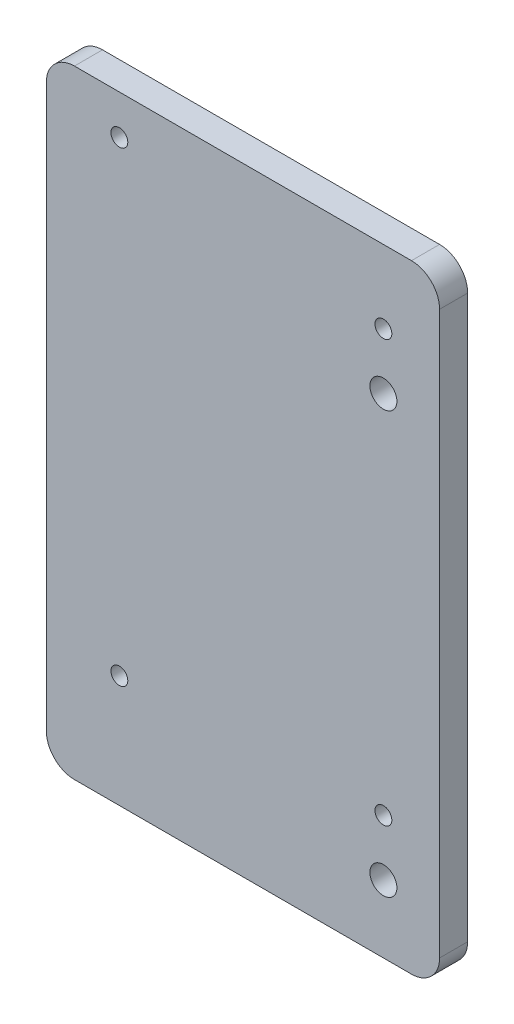
ISO-10303-21;
HEADER;
FILE_DESCRIPTION(('STEP AP214'),'2;1');
FILE_NAME('part.step','',(''),(''),'','','');
FILE_SCHEMA(('AUTOMOTIVE_DESIGN { 1 0 10303 214 1 1 1 1 }'));
ENDSEC;
DATA;
#1=APPLICATION_CONTEXT('core data for automotive mechanical design processes');
#2=APPLICATION_PROTOCOL_DEFINITION('international standard','automotive_design',2000,#1);
#3=PRODUCT_CONTEXT('',#1,'mechanical');
#4=PRODUCT('Part','Part','',(#3));
#5=PRODUCT_RELATED_PRODUCT_CATEGORY('part','',(#4));
#6=PRODUCT_DEFINITION_FORMATION('','',#4);
#7=PRODUCT_DEFINITION_CONTEXT('part definition',#1,'design');
#8=PRODUCT_DEFINITION('design','',#6,#7);
#9=PRODUCT_DEFINITION_SHAPE('','',#8);
#10=(LENGTH_UNIT() NAMED_UNIT(*) SI_UNIT(.MILLI.,.METRE.));
#11=(NAMED_UNIT(*) PLANE_ANGLE_UNIT() SI_UNIT($,.RADIAN.));
#12=(NAMED_UNIT(*) SI_UNIT($,.STERADIAN.) SOLID_ANGLE_UNIT());
#13=UNCERTAINTY_MEASURE_WITH_UNIT(LENGTH_MEASURE(1.E-05),#10,'distance_accuracy_value','');
#14=(GEOMETRIC_REPRESENTATION_CONTEXT(3) GLOBAL_UNCERTAINTY_ASSIGNED_CONTEXT((#13)) GLOBAL_UNIT_ASSIGNED_CONTEXT((#10,
#11,#12)) REPRESENTATION_CONTEXT('',''));
#15=CARTESIAN_POINT('',(0.,0.,0.));
#16=DIRECTION('',(0.,0.,1.));
#17=DIRECTION('',(1.,0.,0.));
#18=AXIS2_PLACEMENT_3D('',#15,#16,#17);
#19=CARTESIAN_POINT('',(0.,0.,5.));
#20=DIRECTION('',(0.,0.,1.));
#21=DIRECTION('',(1.,0.,0.));
#22=AXIS2_PLACEMENT_3D('',#19,#20,#21);
#23=PLANE('',#22);
#24=CARTESIAN_POINT('',(-22.,48.,5.));
#25=DIRECTION('',(0.,0.,1.));
#26=DIRECTION('',(1.,0.,0.));
#27=AXIS2_PLACEMENT_3D('',#24,#25,#26);
#28=CIRCLE('',#27,1.5);
#29=CARTESIAN_POINT('',(-20.5,48.,5.));
#30=VERTEX_POINT('',#29);
#31=EDGE_CURVE('E198',#30,#30,#28,.T.);
#32=ORIENTED_EDGE('',*,*,#31,.F.);
#33=EDGE_LOOP('',(#32));
#34=FACE_BOUND('',#33,.T.);
#35=CARTESIAN_POINT('',(25.,32.,5.));
#36=DIRECTION('',(0.,0.,1.));
#37=DIRECTION('',(1.,0.,0.));
#38=AXIS2_PLACEMENT_3D('',#35,#36,#37);
#39=CIRCLE('',#38,2.4);
#40=CARTESIAN_POINT('',(27.4,32.,5.));
#41=VERTEX_POINT('',#40);
#42=EDGE_CURVE('E186',#41,#41,#39,.T.);
#43=ORIENTED_EDGE('',*,*,#42,.F.);
#44=EDGE_LOOP('',(#43));
#45=FACE_BOUND('',#44,.T.);
#46=CARTESIAN_POINT('',(25.,42.,5.));
#47=DIRECTION('',(0.,0.,1.));
#48=DIRECTION('',(1.,0.,0.));
#49=AXIS2_PLACEMENT_3D('',#46,#47,#48);
#50=CIRCLE('',#49,1.5);
#51=CARTESIAN_POINT('',(26.5,42.,5.));
#52=VERTEX_POINT('',#51);
#53=EDGE_CURVE('E127',#52,#52,#50,.T.);
#54=ORIENTED_EDGE('',*,*,#53,.F.);
#55=EDGE_LOOP('',(#54));
#56=FACE_BOUND('',#55,.T.);
#57=DIRECTION('',(1.,0.,0.));
#58=VECTOR('',#57,1.);
#59=CARTESIAN_POINT('',(-35.,-55.,5.));
#60=LINE('',#59,#58);
#61=CARTESIAN_POINT('',(-30.,-55.,5.));
#62=VERTEX_POINT('',#61);
#63=CARTESIAN_POINT('',(30.,-55.,5.));
#64=VERTEX_POINT('',#63);
#65=EDGE_CURVE('E136',#62,#64,#60,.T.);
#66=ORIENTED_EDGE('',*,*,#65,.T.);
#67=CARTESIAN_POINT('',(30.,-50.,5.));
#68=DIRECTION('',(0.,0.,1.));
#69=DIRECTION('',(1.,0.,0.));
#70=AXIS2_PLACEMENT_3D('',#67,#68,#69);
#71=CIRCLE('',#70,5.);
#72=CARTESIAN_POINT('',(35.,-50.,5.));
#73=VERTEX_POINT('',#72);
#74=EDGE_CURVE('E155',#64,#73,#71,.T.);
#75=ORIENTED_EDGE('',*,*,#74,.T.);
#76=DIRECTION('',(0.,1.,0.));
#77=VECTOR('',#76,1.);
#78=CARTESIAN_POINT('',(35.,55.,5.));
#79=LINE('',#78,#77);
#80=CARTESIAN_POINT('',(35.,50.,5.));
#81=VERTEX_POINT('',#80);
#82=EDGE_CURVE('E119',#73,#81,#79,.T.);
#83=ORIENTED_EDGE('',*,*,#82,.T.);
#84=CARTESIAN_POINT('',(30.,50.,5.));
#85=DIRECTION('',(0.,0.,1.));
#86=DIRECTION('',(1.,0.,0.));
#87=AXIS2_PLACEMENT_3D('',#84,#85,#86);
#88=CIRCLE('',#87,5.);
#89=CARTESIAN_POINT('',(30.,55.,5.));
#90=VERTEX_POINT('',#89);
#91=EDGE_CURVE('E150',#81,#90,#88,.T.);
#92=ORIENTED_EDGE('',*,*,#91,.T.);
#93=DIRECTION('',(-1.,0.,0.));
#94=VECTOR('',#93,1.);
#95=CARTESIAN_POINT('',(-35.,55.,5.));
#96=LINE('',#95,#94);
#97=CARTESIAN_POINT('',(-30.,55.,5.));
#98=VERTEX_POINT('',#97);
#99=EDGE_CURVE('E166',#90,#98,#96,.T.);
#100=ORIENTED_EDGE('',*,*,#99,.T.);
#101=CARTESIAN_POINT('',(-30.,50.,5.));
#102=DIRECTION('',(0.,0.,1.));
#103=DIRECTION('',(1.,0.,0.));
#104=AXIS2_PLACEMENT_3D('',#101,#102,#103);
#105=CIRCLE('',#104,5.);
#106=CARTESIAN_POINT('',(-35.,50.,5.));
#107=VERTEX_POINT('',#106);
#108=EDGE_CURVE('E55',#98,#107,#105,.T.);
#109=ORIENTED_EDGE('',*,*,#108,.T.);
#110=DIRECTION('',(0.,-1.,0.));
#111=VECTOR('',#110,1.);
#112=CARTESIAN_POINT('',(-35.,55.,5.));
#113=LINE('',#112,#111);
#114=CARTESIAN_POINT('',(-35.,-50.,5.));
#115=VERTEX_POINT('',#114);
#116=EDGE_CURVE('E174',#107,#115,#113,.T.);
#117=ORIENTED_EDGE('',*,*,#116,.T.);
#118=CARTESIAN_POINT('',(-30.,-50.,5.));
#119=DIRECTION('',(0.,0.,1.));
#120=DIRECTION('',(1.,0.,0.));
#121=AXIS2_PLACEMENT_3D('',#118,#119,#120);
#122=CIRCLE('',#121,5.);
#123=EDGE_CURVE('E153',#115,#62,#122,.T.);
#124=ORIENTED_EDGE('',*,*,#123,.T.);
#125=EDGE_LOOP('',(#66,#75,#83,#92,#100,#109,#117,#124));
#126=FACE_BOUND('',#125,.T.);
#127=CARTESIAN_POINT('',(25.,-33.,5.));
#128=DIRECTION('',(0.,0.,1.));
#129=DIRECTION('',(1.,0.,0.));
#130=AXIS2_PLACEMENT_3D('',#127,#128,#129);
#131=CIRCLE('',#130,1.5);
#132=CARTESIAN_POINT('',(26.5,-33.,5.));
#133=VERTEX_POINT('',#132);
#134=EDGE_CURVE('E181',#133,#133,#131,.T.);
#135=ORIENTED_EDGE('',*,*,#134,.F.);
#136=EDGE_LOOP('',(#135));
#137=FACE_BOUND('',#136,.T.);
#138=CARTESIAN_POINT('',(25.,-43.,5.));
#139=DIRECTION('',(0.,0.,1.));
#140=DIRECTION('',(1.,0.,0.));
#141=AXIS2_PLACEMENT_3D('',#138,#139,#140);
#142=CIRCLE('',#141,2.4);
#143=CARTESIAN_POINT('',(27.4,-43.,5.));
#144=VERTEX_POINT('',#143);
#145=EDGE_CURVE('E192',#144,#144,#142,.T.);
#146=ORIENTED_EDGE('',*,*,#145,.F.);
#147=EDGE_LOOP('',(#146));
#148=FACE_BOUND('',#147,.T.);
#149=CARTESIAN_POINT('',(-22.,-35.,5.));
#150=DIRECTION('',(0.,0.,1.));
#151=DIRECTION('',(1.,0.,0.));
#152=AXIS2_PLACEMENT_3D('',#149,#150,#151);
#153=CIRCLE('',#152,1.5);
#154=CARTESIAN_POINT('',(-20.5,-35.,5.));
#155=VERTEX_POINT('',#154);
#156=EDGE_CURVE('E204',#155,#155,#153,.T.);
#157=ORIENTED_EDGE('',*,*,#156,.F.);
#158=EDGE_LOOP('',(#157));
#159=FACE_BOUND('',#158,.T.);
#160=ADVANCED_FACE('F33',(#34,#45,#56,#126,#137,#148,#159),#23,.T.);
#161=CARTESIAN_POINT('',(0.,0.,0.));
#162=DIRECTION('',(0.,0.,1.));
#163=DIRECTION('',(1.,0.,0.));
#164=AXIS2_PLACEMENT_3D('',#161,#162,#163);
#165=PLANE('',#164);
#166=DIRECTION('',(0.,1.,0.));
#167=VECTOR('',#166,1.);
#168=CARTESIAN_POINT('',(35.,55.,0.));
#169=LINE('',#168,#167);
#170=CARTESIAN_POINT('',(35.,-50.,0.));
#171=VERTEX_POINT('',#170);
#172=CARTESIAN_POINT('',(35.,50.,0.));
#173=VERTEX_POINT('',#172);
#174=EDGE_CURVE('E116',#171,#173,#169,.T.);
#175=ORIENTED_EDGE('',*,*,#174,.F.);
#176=CARTESIAN_POINT('',(30.,-50.,0.));
#177=DIRECTION('',(0.,0.,1.));
#178=DIRECTION('',(1.,0.,0.));
#179=AXIS2_PLACEMENT_3D('',#176,#177,#178);
#180=CIRCLE('',#179,5.);
#181=CARTESIAN_POINT('',(30.,-55.,0.));
#182=VERTEX_POINT('',#181);
#183=EDGE_CURVE('E99',#171,#182,#180,.F.);
#184=ORIENTED_EDGE('',*,*,#183,.T.);
#185=DIRECTION('',(1.,0.,0.));
#186=VECTOR('',#185,1.);
#187=CARTESIAN_POINT('',(-35.,-55.,0.));
#188=LINE('',#187,#186);
#189=CARTESIAN_POINT('',(-30.,-55.,0.));
#190=VERTEX_POINT('',#189);
#191=EDGE_CURVE('E140',#190,#182,#188,.T.);
#192=ORIENTED_EDGE('',*,*,#191,.F.);
#193=CARTESIAN_POINT('',(-30.,-50.,0.));
#194=DIRECTION('',(0.,0.,1.));
#195=DIRECTION('',(1.,0.,0.));
#196=AXIS2_PLACEMENT_3D('',#193,#194,#195);
#197=CIRCLE('',#196,5.);
#198=CARTESIAN_POINT('',(-35.,-50.,0.));
#199=VERTEX_POINT('',#198);
#200=EDGE_CURVE('E110',#190,#199,#197,.F.);
#201=ORIENTED_EDGE('',*,*,#200,.T.);
#202=DIRECTION('',(0.,-1.,0.));
#203=VECTOR('',#202,1.);
#204=CARTESIAN_POINT('',(-35.,55.,0.));
#205=LINE('',#204,#203);
#206=CARTESIAN_POINT('',(-35.,50.,0.));
#207=VERTEX_POINT('',#206);
#208=EDGE_CURVE('E130',#207,#199,#205,.T.);
#209=ORIENTED_EDGE('',*,*,#208,.F.);
#210=CARTESIAN_POINT('',(-30.,50.,0.));
#211=DIRECTION('',(0.,0.,1.));
#212=DIRECTION('',(1.,0.,0.));
#213=AXIS2_PLACEMENT_3D('',#210,#211,#212);
#214=CIRCLE('',#213,5.);
#215=CARTESIAN_POINT('',(-30.,55.,0.));
#216=VERTEX_POINT('',#215);
#217=EDGE_CURVE('E144',#207,#216,#214,.F.);
#218=ORIENTED_EDGE('',*,*,#217,.T.);
#219=DIRECTION('',(-1.,0.,0.));
#220=VECTOR('',#219,1.);
#221=CARTESIAN_POINT('',(-35.,55.,0.));
#222=LINE('',#221,#220);
#223=CARTESIAN_POINT('',(30.,55.,0.));
#224=VERTEX_POINT('',#223);
#225=EDGE_CURVE('E126',#224,#216,#222,.T.);
#226=ORIENTED_EDGE('',*,*,#225,.F.);
#227=CARTESIAN_POINT('',(30.,50.,0.));
#228=DIRECTION('',(0.,0.,1.));
#229=DIRECTION('',(1.,0.,0.));
#230=AXIS2_PLACEMENT_3D('',#227,#228,#229);
#231=CIRCLE('',#230,5.);
#232=EDGE_CURVE('E120',#224,#173,#231,.F.);
#233=ORIENTED_EDGE('',*,*,#232,.T.);
#234=EDGE_LOOP('',(#175,#184,#192,#201,#209,#218,#226,#233));
#235=FACE_BOUND('',#234,.T.);
#236=CARTESIAN_POINT('',(25.,42.,0.));
#237=DIRECTION('',(0.,0.,1.));
#238=DIRECTION('',(1.,0.,0.));
#239=AXIS2_PLACEMENT_3D('',#236,#237,#238);
#240=CIRCLE('',#239,1.5);
#241=CARTESIAN_POINT('',(26.5,42.,0.));
#242=VERTEX_POINT('',#241);
#243=EDGE_CURVE('E133',#242,#242,#240,.T.);
#244=ORIENTED_EDGE('',*,*,#243,.T.);
#245=EDGE_LOOP('',(#244));
#246=FACE_BOUND('',#245,.T.);
#247=CARTESIAN_POINT('',(25.,-33.,0.));
#248=DIRECTION('',(0.,0.,1.));
#249=DIRECTION('',(1.,0.,0.));
#250=AXIS2_PLACEMENT_3D('',#247,#248,#249);
#251=CIRCLE('',#250,1.5);
#252=CARTESIAN_POINT('',(26.5,-33.,0.));
#253=VERTEX_POINT('',#252);
#254=EDGE_CURVE('E183',#253,#253,#251,.T.);
#255=ORIENTED_EDGE('',*,*,#254,.T.);
#256=EDGE_LOOP('',(#255));
#257=FACE_BOUND('',#256,.T.);
#258=CARTESIAN_POINT('',(25.,32.,0.));
#259=DIRECTION('',(0.,0.,1.));
#260=DIRECTION('',(1.,0.,0.));
#261=AXIS2_PLACEMENT_3D('',#258,#259,#260);
#262=CIRCLE('',#261,2.4);
#263=CARTESIAN_POINT('',(27.4,32.,0.));
#264=VERTEX_POINT('',#263);
#265=EDGE_CURVE('E189',#264,#264,#262,.T.);
#266=ORIENTED_EDGE('',*,*,#265,.T.);
#267=EDGE_LOOP('',(#266));
#268=FACE_BOUND('',#267,.T.);
#269=CARTESIAN_POINT('',(25.,-43.,0.));
#270=DIRECTION('',(0.,0.,1.));
#271=DIRECTION('',(1.,0.,0.));
#272=AXIS2_PLACEMENT_3D('',#269,#270,#271);
#273=CIRCLE('',#272,2.4);
#274=CARTESIAN_POINT('',(27.4,-43.,0.));
#275=VERTEX_POINT('',#274);
#276=EDGE_CURVE('E195',#275,#275,#273,.T.);
#277=ORIENTED_EDGE('',*,*,#276,.T.);
#278=EDGE_LOOP('',(#277));
#279=FACE_BOUND('',#278,.T.);
#280=CARTESIAN_POINT('',(-22.,48.,0.));
#281=DIRECTION('',(0.,0.,1.));
#282=DIRECTION('',(1.,0.,0.));
#283=AXIS2_PLACEMENT_3D('',#280,#281,#282);
#284=CIRCLE('',#283,1.5);
#285=CARTESIAN_POINT('',(-20.5,48.,0.));
#286=VERTEX_POINT('',#285);
#287=EDGE_CURVE('E201',#286,#286,#284,.T.);
#288=ORIENTED_EDGE('',*,*,#287,.T.);
#289=EDGE_LOOP('',(#288));
#290=FACE_BOUND('',#289,.T.);
#291=CARTESIAN_POINT('',(-22.,-35.,0.));
#292=DIRECTION('',(0.,0.,1.));
#293=DIRECTION('',(1.,0.,0.));
#294=AXIS2_PLACEMENT_3D('',#291,#292,#293);
#295=CIRCLE('',#294,1.5);
#296=CARTESIAN_POINT('',(-20.5,-35.,0.));
#297=VERTEX_POINT('',#296);
#298=EDGE_CURVE('E207',#297,#297,#295,.T.);
#299=ORIENTED_EDGE('',*,*,#298,.T.);
#300=EDGE_LOOP('',(#299));
#301=FACE_BOUND('',#300,.T.);
#302=ADVANCED_FACE('F123',(#235,#246,#257,#268,#279,#290,#301),#165,.F.);
#303=CARTESIAN_POINT('',(35.,55.,5.));
#304=DIRECTION('',(-1.,0.,0.));
#305=DIRECTION('',(0.,-1.,0.));
#306=AXIS2_PLACEMENT_3D('',#303,#304,#305);
#307=PLANE('',#306);
#308=ORIENTED_EDGE('',*,*,#82,.F.);
#309=DIRECTION('',(0.,0.,-1.));
#310=VECTOR('',#309,1.);
#311=CARTESIAN_POINT('',(35.,-50.,5.));
#312=LINE('',#311,#310);
#313=EDGE_CURVE('E103',#73,#171,#312,.T.);
#314=ORIENTED_EDGE('',*,*,#313,.T.);
#315=ORIENTED_EDGE('',*,*,#174,.T.);
#316=DIRECTION('',(0.,0.,-1.));
#317=VECTOR('',#316,1.);
#318=CARTESIAN_POINT('',(35.,50.,5.));
#319=LINE('',#318,#317);
#320=EDGE_CURVE('E121',#173,#81,#319,.F.);
#321=ORIENTED_EDGE('',*,*,#320,.T.);
#322=EDGE_LOOP('',(#308,#314,#315,#321));
#323=FACE_BOUND('',#322,.T.);
#324=ADVANCED_FACE('F115',(#323),#307,.F.);
#325=CARTESIAN_POINT('',(-35.,55.,5.));
#326=DIRECTION('',(0.,-1.,0.));
#327=DIRECTION('',(0.,0.,-1.));
#328=AXIS2_PLACEMENT_3D('',#325,#326,#327);
#329=PLANE('',#328);
#330=ORIENTED_EDGE('',*,*,#225,.T.);
#331=DIRECTION('',(0.,0.,-1.));
#332=VECTOR('',#331,1.);
#333=CARTESIAN_POINT('',(-30.,55.,5.));
#334=LINE('',#333,#332);
#335=EDGE_CURVE('E11',#216,#98,#334,.F.);
#336=ORIENTED_EDGE('',*,*,#335,.T.);
#337=ORIENTED_EDGE('',*,*,#99,.F.);
#338=DIRECTION('',(0.,0.,-1.));
#339=VECTOR('',#338,1.);
#340=CARTESIAN_POINT('',(30.,55.,5.));
#341=LINE('',#340,#339);
#342=EDGE_CURVE('E41',#90,#224,#341,.T.);
#343=ORIENTED_EDGE('',*,*,#342,.T.);
#344=EDGE_LOOP('',(#330,#336,#337,#343));
#345=FACE_BOUND('',#344,.T.);
#346=ADVANCED_FACE('F164',(#345),#329,.F.);
#347=CARTESIAN_POINT('',(-35.,55.,5.));
#348=DIRECTION('',(1.,0.,0.));
#349=DIRECTION('',(0.,1.,0.));
#350=AXIS2_PLACEMENT_3D('',#347,#348,#349);
#351=PLANE('',#350);
#352=ORIENTED_EDGE('',*,*,#208,.T.);
#353=DIRECTION('',(0.,0.,-1.));
#354=VECTOR('',#353,1.);
#355=CARTESIAN_POINT('',(-35.,-50.,5.));
#356=LINE('',#355,#354);
#357=EDGE_CURVE('E48',#199,#115,#356,.F.);
#358=ORIENTED_EDGE('',*,*,#357,.T.);
#359=ORIENTED_EDGE('',*,*,#116,.F.);
#360=DIRECTION('',(0.,0.,-1.));
#361=VECTOR('',#360,1.);
#362=CARTESIAN_POINT('',(-35.,50.,5.));
#363=LINE('',#362,#361);
#364=EDGE_CURVE('E157',#107,#207,#363,.T.);
#365=ORIENTED_EDGE('',*,*,#364,.T.);
#366=EDGE_LOOP('',(#352,#358,#359,#365));
#367=FACE_BOUND('',#366,.T.);
#368=ADVANCED_FACE('F173',(#367),#351,.F.);
#369=CARTESIAN_POINT('',(-35.,-55.,5.));
#370=DIRECTION('',(0.,1.,0.));
#371=DIRECTION('',(0.,0.,1.));
#372=AXIS2_PLACEMENT_3D('',#369,#370,#371);
#373=PLANE('',#372);
#374=ORIENTED_EDGE('',*,*,#191,.T.);
#375=DIRECTION('',(0.,0.,-1.));
#376=VECTOR('',#375,1.);
#377=CARTESIAN_POINT('',(30.,-55.,5.));
#378=LINE('',#377,#376);
#379=EDGE_CURVE('E104',#182,#64,#378,.F.);
#380=ORIENTED_EDGE('',*,*,#379,.T.);
#381=ORIENTED_EDGE('',*,*,#65,.F.);
#382=DIRECTION('',(0.,0.,-1.));
#383=VECTOR('',#382,1.);
#384=CARTESIAN_POINT('',(-30.,-55.,5.));
#385=LINE('',#384,#383);
#386=EDGE_CURVE('E109',#62,#190,#385,.T.);
#387=ORIENTED_EDGE('',*,*,#386,.T.);
#388=EDGE_LOOP('',(#374,#380,#381,#387));
#389=FACE_BOUND('',#388,.T.);
#390=ADVANCED_FACE('F229',(#389),#373,.F.);
#391=CARTESIAN_POINT('',(25.,42.,5.));
#392=DIRECTION('',(0.,0.,-1.));
#393=DIRECTION('',(-1.,0.,0.));
#394=AXIS2_PLACEMENT_3D('',#391,#392,#393);
#395=CYLINDRICAL_SURFACE('',#394,1.5);
#396=ORIENTED_EDGE('',*,*,#53,.T.);
#397=EDGE_LOOP('',(#396));
#398=FACE_BOUND('',#397,.T.);
#399=ORIENTED_EDGE('',*,*,#243,.F.);
#400=EDGE_LOOP('',(#399));
#401=FACE_BOUND('',#400,.T.);
#402=ADVANCED_FACE('F226',(#398,#401),#395,.F.);
#403=CARTESIAN_POINT('',(25.,-33.,5.));
#404=DIRECTION('',(0.,0.,-1.));
#405=DIRECTION('',(-1.,0.,0.));
#406=AXIS2_PLACEMENT_3D('',#403,#404,#405);
#407=CYLINDRICAL_SURFACE('',#406,1.5);
#408=ORIENTED_EDGE('',*,*,#134,.T.);
#409=EDGE_LOOP('',(#408));
#410=FACE_BOUND('',#409,.T.);
#411=ORIENTED_EDGE('',*,*,#254,.F.);
#412=EDGE_LOOP('',(#411));
#413=FACE_BOUND('',#412,.T.);
#414=ADVANCED_FACE('F278',(#410,#413),#407,.F.);
#415=CARTESIAN_POINT('',(25.,32.,5.));
#416=DIRECTION('',(0.,0.,-1.));
#417=DIRECTION('',(-1.,0.,0.));
#418=AXIS2_PLACEMENT_3D('',#415,#416,#417);
#419=CYLINDRICAL_SURFACE('',#418,2.4);
#420=ORIENTED_EDGE('',*,*,#42,.T.);
#421=EDGE_LOOP('',(#420));
#422=FACE_BOUND('',#421,.T.);
#423=ORIENTED_EDGE('',*,*,#265,.F.);
#424=EDGE_LOOP('',(#423));
#425=FACE_BOUND('',#424,.T.);
#426=ADVANCED_FACE('F261',(#422,#425),#419,.F.);
#427=CARTESIAN_POINT('',(25.,-43.,5.));
#428=DIRECTION('',(0.,0.,-1.));
#429=DIRECTION('',(-1.,0.,0.));
#430=AXIS2_PLACEMENT_3D('',#427,#428,#429);
#431=CYLINDRICAL_SURFACE('',#430,2.4);
#432=ORIENTED_EDGE('',*,*,#145,.T.);
#433=EDGE_LOOP('',(#432));
#434=FACE_BOUND('',#433,.T.);
#435=ORIENTED_EDGE('',*,*,#276,.F.);
#436=EDGE_LOOP('',(#435));
#437=FACE_BOUND('',#436,.T.);
#438=ADVANCED_FACE('F257',(#434,#437),#431,.F.);
#439=CARTESIAN_POINT('',(-22.,48.,5.));
#440=DIRECTION('',(0.,0.,-1.));
#441=DIRECTION('',(-1.,0.,0.));
#442=AXIS2_PLACEMENT_3D('',#439,#440,#441);
#443=CYLINDRICAL_SURFACE('',#442,1.5);
#444=ORIENTED_EDGE('',*,*,#31,.T.);
#445=EDGE_LOOP('',(#444));
#446=FACE_BOUND('',#445,.T.);
#447=ORIENTED_EDGE('',*,*,#287,.F.);
#448=EDGE_LOOP('',(#447));
#449=FACE_BOUND('',#448,.T.);
#450=ADVANCED_FACE('F260',(#446,#449),#443,.F.);
#451=CARTESIAN_POINT('',(-22.,-35.,5.));
#452=DIRECTION('',(0.,0.,-1.));
#453=DIRECTION('',(-1.,0.,0.));
#454=AXIS2_PLACEMENT_3D('',#451,#452,#453);
#455=CYLINDRICAL_SURFACE('',#454,1.5);
#456=ORIENTED_EDGE('',*,*,#156,.T.);
#457=EDGE_LOOP('',(#456));
#458=FACE_BOUND('',#457,.T.);
#459=ORIENTED_EDGE('',*,*,#298,.F.);
#460=EDGE_LOOP('',(#459));
#461=FACE_BOUND('',#460,.T.);
#462=ADVANCED_FACE('F213',(#458,#461),#455,.F.);
#463=CARTESIAN_POINT('',(30.,-50.,5.));
#464=DIRECTION('',(0.,0.,-1.));
#465=DIRECTION('',(-1.,0.,0.));
#466=AXIS2_PLACEMENT_3D('',#463,#464,#465);
#467=CYLINDRICAL_SURFACE('',#466,5.);
#468=ORIENTED_EDGE('',*,*,#74,.F.);
#469=ORIENTED_EDGE('',*,*,#379,.F.);
#470=ORIENTED_EDGE('',*,*,#183,.F.);
#471=ORIENTED_EDGE('',*,*,#313,.F.);
#472=EDGE_LOOP('',(#468,#469,#470,#471));
#473=FACE_BOUND('',#472,.T.);
#474=ADVANCED_FACE('F102',(#473),#467,.T.);
#475=CARTESIAN_POINT('',(-30.,-50.,5.));
#476=DIRECTION('',(0.,0.,-1.));
#477=DIRECTION('',(-1.,0.,0.));
#478=AXIS2_PLACEMENT_3D('',#475,#476,#477);
#479=CYLINDRICAL_SURFACE('',#478,5.);
#480=ORIENTED_EDGE('',*,*,#123,.F.);
#481=ORIENTED_EDGE('',*,*,#357,.F.);
#482=ORIENTED_EDGE('',*,*,#200,.F.);
#483=ORIENTED_EDGE('',*,*,#386,.F.);
#484=EDGE_LOOP('',(#480,#481,#482,#483));
#485=FACE_BOUND('',#484,.T.);
#486=ADVANCED_FACE('F241',(#485),#479,.T.);
#487=CARTESIAN_POINT('',(-30.,50.,5.));
#488=DIRECTION('',(0.,0.,-1.));
#489=DIRECTION('',(-1.,0.,0.));
#490=AXIS2_PLACEMENT_3D('',#487,#488,#489);
#491=CYLINDRICAL_SURFACE('',#490,5.);
#492=ORIENTED_EDGE('',*,*,#108,.F.);
#493=ORIENTED_EDGE('',*,*,#335,.F.);
#494=ORIENTED_EDGE('',*,*,#217,.F.);
#495=ORIENTED_EDGE('',*,*,#364,.F.);
#496=EDGE_LOOP('',(#492,#493,#494,#495));
#497=FACE_BOUND('',#496,.T.);
#498=ADVANCED_FACE('F172',(#497),#491,.T.);
#499=CARTESIAN_POINT('',(30.,50.,5.));
#500=DIRECTION('',(0.,0.,-1.));
#501=DIRECTION('',(-1.,0.,0.));
#502=AXIS2_PLACEMENT_3D('',#499,#500,#501);
#503=CYLINDRICAL_SURFACE('',#502,5.);
#504=ORIENTED_EDGE('',*,*,#91,.F.);
#505=ORIENTED_EDGE('',*,*,#320,.F.);
#506=ORIENTED_EDGE('',*,*,#232,.F.);
#507=ORIENTED_EDGE('',*,*,#342,.F.);
#508=EDGE_LOOP('',(#504,#505,#506,#507));
#509=FACE_BOUND('',#508,.T.);
#510=ADVANCED_FACE('F35',(#509),#503,.T.);
#511=CLOSED_SHELL('',(#160,#302,#324,#346,#368,#390,#402,#414,#426,#438,#450,#462,#474,#486,
#498,#510));
#512=MANIFOLD_SOLID_BREP('B2',#511);
#513=ADVANCED_BREP_SHAPE_REPRESENTATION('',(#18,#512),#14);
#514=SHAPE_DEFINITION_REPRESENTATION(#9,#513);
ENDSEC;
END-ISO-10303-21;
